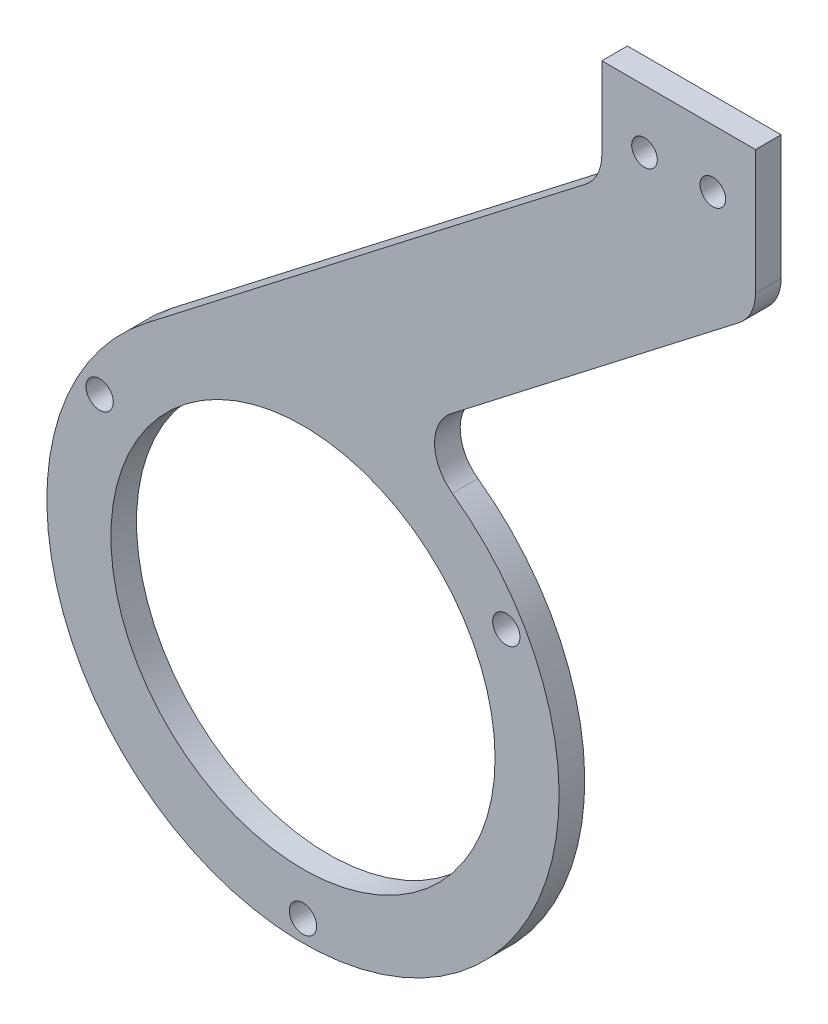
ISO-10303-21;
HEADER;
FILE_DESCRIPTION(('STEP AP214'),'2;1');
FILE_NAME('part.step','',(''),(''),'','','');
FILE_SCHEMA(('AUTOMOTIVE_DESIGN { 1 0 10303 214 1 1 1 1 }'));
ENDSEC;
DATA;
#1=APPLICATION_CONTEXT('core data for automotive mechanical design processes');
#2=APPLICATION_PROTOCOL_DEFINITION('international standard','automotive_design',2000,#1);
#3=PRODUCT_CONTEXT('',#1,'mechanical');
#4=PRODUCT('Part','Part','',(#3));
#5=PRODUCT_RELATED_PRODUCT_CATEGORY('part','',(#4));
#6=PRODUCT_DEFINITION_FORMATION('','',#4);
#7=PRODUCT_DEFINITION_CONTEXT('part definition',#1,'design');
#8=PRODUCT_DEFINITION('design','',#6,#7);
#9=PRODUCT_DEFINITION_SHAPE('','',#8);
#10=(LENGTH_UNIT() NAMED_UNIT(*) SI_UNIT(.MILLI.,.METRE.));
#11=(NAMED_UNIT(*) PLANE_ANGLE_UNIT() SI_UNIT($,.RADIAN.));
#12=(NAMED_UNIT(*) SI_UNIT($,.STERADIAN.) SOLID_ANGLE_UNIT());
#13=UNCERTAINTY_MEASURE_WITH_UNIT(LENGTH_MEASURE(1.E-05),#10,'distance_accuracy_value','');
#14=(GEOMETRIC_REPRESENTATION_CONTEXT(3) GLOBAL_UNCERTAINTY_ASSIGNED_CONTEXT((#13)) GLOBAL_UNIT_ASSIGNED_CONTEXT((#10,
#11,#12)) REPRESENTATION_CONTEXT('',''));
#15=CARTESIAN_POINT('',(0.,0.,0.));
#16=DIRECTION('',(0.,0.,1.));
#17=DIRECTION('',(1.,0.,0.));
#18=AXIS2_PLACEMENT_3D('',#15,#16,#17);
#19=CARTESIAN_POINT('',(0.,0.,3.));
#20=DIRECTION('',(0.,0.,1.));
#21=DIRECTION('',(1.,0.,0.));
#22=AXIS2_PLACEMENT_3D('',#19,#20,#21);
#23=PLANE('',#22);
#24=DIRECTION('',(0.790986985975341,0.611832973954204,0.));
#25=VECTOR('',#24,1.);
#26=CARTESIAN_POINT('',(53.,59.9594537716596,3.));
#27=LINE('',#26,#25);
#28=CARTESIAN_POINT('',(17.353015440065,32.386306599192,3.));
#29=VERTEX_POINT('',#28);
#30=CARTESIAN_POINT('',(51.059164869771,58.4582066579431,3.));
#31=VERTEX_POINT('',#30);
#32=EDGE_CURVE('E137',#29,#31,#27,.T.);
#33=ORIENTED_EDGE('',*,*,#32,.T.);
#34=CARTESIAN_POINT('',(48.,62.4131415878198,3.));
#35=DIRECTION('',(0.,0.,1.));
#36=DIRECTION('',(1.,0.,0.));
#37=AXIS2_PLACEMENT_3D('',#34,#35,#36);
#38=CIRCLE('',#37,5.);
#39=CARTESIAN_POINT('',(53.,62.4131415878198,3.));
#40=VERTEX_POINT('',#39);
#41=EDGE_CURVE('E150',#31,#40,#38,.T.);
#42=ORIENTED_EDGE('',*,*,#41,.T.);
#43=DIRECTION('',(0.,1.,0.));
#44=VECTOR('',#43,1.);
#45=CARTESIAN_POINT('',(53.,77.,3.));
#46=LINE('',#45,#44);
#47=CARTESIAN_POINT('',(53.,77.,3.));
#48=VERTEX_POINT('',#47);
#49=EDGE_CURVE('E141',#40,#48,#46,.T.);
#50=ORIENTED_EDGE('',*,*,#49,.T.);
#51=DIRECTION('',(-1.,0.,0.));
#52=VECTOR('',#51,1.);
#53=CARTESIAN_POINT('',(35.,77.,3.));
#54=LINE('',#53,#52);
#55=CARTESIAN_POINT('',(35.,77.,3.));
#56=VERTEX_POINT('',#55);
#57=EDGE_CURVE('E125',#48,#56,#54,.T.);
#58=ORIENTED_EDGE('',*,*,#57,.T.);
#59=DIRECTION('',(0.,-1.,0.));
#60=VECTOR('',#59,1.);
#61=CARTESIAN_POINT('',(35.,65.,3.));
#62=LINE('',#61,#60);
#63=CARTESIAN_POINT('',(35.,67.4536878161602,3.));
#64=VERTEX_POINT('',#63);
#65=EDGE_CURVE('E169',#56,#64,#62,.T.);
#66=ORIENTED_EDGE('',*,*,#65,.T.);
#67=CARTESIAN_POINT('',(30.,67.4536878161602,3.));
#68=DIRECTION('',(0.,0.,1.));
#69=DIRECTION('',(1.,0.,0.));
#70=AXIS2_PLACEMENT_3D('',#67,#68,#69);
#71=CIRCLE('',#70,5.);
#72=CARTESIAN_POINT('',(33.059164869771,63.4987528862835,3.));
#73=VERTEX_POINT('',#72);
#74=EDGE_CURVE('E45',#64,#73,#71,.F.);
#75=ORIENTED_EDGE('',*,*,#74,.T.);
#76=DIRECTION('',(-0.790986985975341,-0.611832973954204,0.));
#77=VECTOR('',#76,1.);
#78=CARTESIAN_POINT('',(-18.3549892186261,23.7296095792602,3.));
#79=LINE('',#78,#77);
#80=CARTESIAN_POINT('',(-18.3549892186261,23.7296095792602,3.));
#81=VERTEX_POINT('',#80);
#82=EDGE_CURVE('E166',#73,#81,#79,.T.);
#83=ORIENTED_EDGE('',*,*,#82,.T.);
#84=CARTESIAN_POINT('',(0.,0.,3.));
#85=DIRECTION('',(0.,0.,1.));
#86=DIRECTION('',(1.,0.,0.));
#87=AXIS2_PLACEMENT_3D('',#84,#85,#86);
#88=CIRCLE('',#87,30.);
#89=CARTESIAN_POINT('',(17.496154551288,24.3697471451274,3.));
#90=VERTEX_POINT('',#89);
#91=EDGE_CURVE('E211',#81,#90,#88,.T.);
#92=ORIENTED_EDGE('',*,*,#91,.T.);
#93=CARTESIAN_POINT('',(20.412180309836,28.4313716693153,3.));
#94=DIRECTION('',(0.,0.,1.));
#95=DIRECTION('',(1.,0.,0.));
#96=AXIS2_PLACEMENT_3D('',#93,#94,#95);
#97=CIRCLE('',#96,5.);
#98=EDGE_CURVE('E243',#90,#29,#97,.F.);
#99=ORIENTED_EDGE('',*,*,#98,.T.);
#100=EDGE_LOOP('',(#33,#42,#50,#58,#66,#75,#83,#92,#99));
#101=FACE_BOUND('',#100,.T.);
#102=CARTESIAN_POINT('',(48.,70.2,3.));
#103=DIRECTION('',(0.,0.,1.));
#104=DIRECTION('',(1.,0.,0.));
#105=AXIS2_PLACEMENT_3D('',#102,#103,#104);
#106=CIRCLE('',#105,1.5);
#107=CARTESIAN_POINT('',(49.5,70.2,3.));
#108=VERTEX_POINT('',#107);
#109=EDGE_CURVE('E220',#108,#108,#106,.T.);
#110=ORIENTED_EDGE('',*,*,#109,.F.);
#111=EDGE_LOOP('',(#110));
#112=FACE_BOUND('',#111,.T.);
#113=CARTESIAN_POINT('',(40.,70.2,3.));
#114=DIRECTION('',(0.,0.,1.));
#115=DIRECTION('',(1.,0.,0.));
#116=AXIS2_PLACEMENT_3D('',#113,#114,#115);
#117=CIRCLE('',#116,1.5);
#118=CARTESIAN_POINT('',(41.5,70.2,3.));
#119=VERTEX_POINT('',#118);
#120=EDGE_CURVE('E227',#119,#119,#117,.T.);
#121=ORIENTED_EDGE('',*,*,#120,.F.);
#122=EDGE_LOOP('',(#121));
#123=FACE_BOUND('',#122,.T.);
#124=CARTESIAN_POINT('',(-23.8156986040721,13.75,3.));
#125=DIRECTION('',(0.,0.,1.));
#126=DIRECTION('',(1.,0.,0.));
#127=AXIS2_PLACEMENT_3D('',#124,#125,#126);
#128=CIRCLE('',#127,1.6);
#129=CARTESIAN_POINT('',(-22.2156986040721,13.75,3.));
#130=VERTEX_POINT('',#129);
#131=EDGE_CURVE('E183',#130,#130,#128,.T.);
#132=ORIENTED_EDGE('',*,*,#131,.F.);
#133=EDGE_LOOP('',(#132));
#134=FACE_BOUND('',#133,.T.);
#135=CARTESIAN_POINT('',(23.8156986040721,13.75,3.));
#136=DIRECTION('',(0.,0.,1.));
#137=DIRECTION('',(1.,0.,0.));
#138=AXIS2_PLACEMENT_3D('',#135,#136,#137);
#139=CIRCLE('',#138,1.6);
#140=CARTESIAN_POINT('',(25.4156986040721,13.75,3.));
#141=VERTEX_POINT('',#140);
#142=EDGE_CURVE('E195',#141,#141,#139,.T.);
#143=ORIENTED_EDGE('',*,*,#142,.F.);
#144=EDGE_LOOP('',(#143));
#145=FACE_BOUND('',#144,.T.);
#146=CARTESIAN_POINT('',(0.,0.,3.));
#147=DIRECTION('',(0.,0.,1.));
#148=DIRECTION('',(1.,0.,0.));
#149=AXIS2_PLACEMENT_3D('',#146,#147,#148);
#150=CIRCLE('',#149,22.5);
#151=CARTESIAN_POINT('',(22.5,0.,3.));
#152=VERTEX_POINT('',#151);
#153=EDGE_CURVE('E204',#152,#152,#150,.T.);
#154=ORIENTED_EDGE('',*,*,#153,.F.);
#155=EDGE_LOOP('',(#154));
#156=FACE_BOUND('',#155,.T.);
#157=CARTESIAN_POINT('',(0.,-27.5,3.));
#158=DIRECTION('',(0.,0.,1.));
#159=DIRECTION('',(1.,0.,0.));
#160=AXIS2_PLACEMENT_3D('',#157,#158,#159);
#161=CIRCLE('',#160,1.60000000000009);
#162=CARTESIAN_POINT('',(1.60000000000009,-27.5,3.));
#163=VERTEX_POINT('',#162);
#164=EDGE_CURVE('E203',#163,#163,#161,.T.);
#165=ORIENTED_EDGE('',*,*,#164,.F.);
#166=EDGE_LOOP('',(#165));
#167=FACE_BOUND('',#166,.T.);
#168=ADVANCED_FACE('F37',(#101,#112,#123,#134,#145,#156,#167),#23,.T.);
#169=CARTESIAN_POINT('',(0.,0.,0.));
#170=DIRECTION('',(0.,0.,1.));
#171=DIRECTION('',(1.,0.,0.));
#172=AXIS2_PLACEMENT_3D('',#169,#170,#171);
#173=PLANE('',#172);
#174=DIRECTION('',(0.,1.,0.));
#175=VECTOR('',#174,1.);
#176=CARTESIAN_POINT('',(53.,77.,0.));
#177=LINE('',#176,#175);
#178=CARTESIAN_POINT('',(53.,62.4131415878198,0.));
#179=VERTEX_POINT('',#178);
#180=CARTESIAN_POINT('',(53.,77.,0.));
#181=VERTEX_POINT('',#180);
#182=EDGE_CURVE('E108',#179,#181,#177,.T.);
#183=ORIENTED_EDGE('',*,*,#182,.F.);
#184=CARTESIAN_POINT('',(48.,62.4131415878198,0.));
#185=DIRECTION('',(0.,0.,1.));
#186=DIRECTION('',(1.,0.,0.));
#187=AXIS2_PLACEMENT_3D('',#184,#185,#186);
#188=CIRCLE('',#187,5.);
#189=CARTESIAN_POINT('',(51.059164869771,58.4582066579431,0.));
#190=VERTEX_POINT('',#189);
#191=EDGE_CURVE('E157',#179,#190,#188,.F.);
#192=ORIENTED_EDGE('',*,*,#191,.T.);
#193=DIRECTION('',(0.790986985975341,0.611832973954204,0.));
#194=VECTOR('',#193,1.);
#195=CARTESIAN_POINT('',(53.,59.9594537716596,0.));
#196=LINE('',#195,#194);
#197=CARTESIAN_POINT('',(17.353015440065,32.386306599192,0.));
#198=VERTEX_POINT('',#197);
#199=EDGE_CURVE('E119',#198,#190,#196,.T.);
#200=ORIENTED_EDGE('',*,*,#199,.F.);
#201=CARTESIAN_POINT('',(20.412180309836,28.4313716693153,0.));
#202=DIRECTION('',(0.,0.,1.));
#203=DIRECTION('',(1.,0.,0.));
#204=AXIS2_PLACEMENT_3D('',#201,#202,#203);
#205=CIRCLE('',#204,5.);
#206=CARTESIAN_POINT('',(17.496154551288,24.3697471451274,0.));
#207=VERTEX_POINT('',#206);
#208=EDGE_CURVE('E242',#198,#207,#205,.T.);
#209=ORIENTED_EDGE('',*,*,#208,.T.);
#210=CARTESIAN_POINT('',(0.,0.,0.));
#211=DIRECTION('',(0.,0.,1.));
#212=DIRECTION('',(1.,0.,0.));
#213=AXIS2_PLACEMENT_3D('',#210,#211,#212);
#214=CIRCLE('',#213,30.);
#215=CARTESIAN_POINT('',(-18.3549892186261,23.7296095792602,0.));
#216=VERTEX_POINT('',#215);
#217=EDGE_CURVE('E208',#216,#207,#214,.T.);
#218=ORIENTED_EDGE('',*,*,#217,.F.);
#219=DIRECTION('',(-0.790986985975341,-0.611832973954204,0.));
#220=VECTOR('',#219,1.);
#221=CARTESIAN_POINT('',(-18.3549892186261,23.7296095792602,0.));
#222=LINE('',#221,#220);
#223=CARTESIAN_POINT('',(33.059164869771,63.4987528862835,0.));
#224=VERTEX_POINT('',#223);
#225=EDGE_CURVE('E127',#224,#216,#222,.T.);
#226=ORIENTED_EDGE('',*,*,#225,.F.);
#227=CARTESIAN_POINT('',(30.,67.4536878161602,0.));
#228=DIRECTION('',(0.,0.,1.));
#229=DIRECTION('',(1.,0.,0.));
#230=AXIS2_PLACEMENT_3D('',#227,#228,#229);
#231=CIRCLE('',#230,5.);
#232=CARTESIAN_POINT('',(35.,67.4536878161602,0.));
#233=VERTEX_POINT('',#232);
#234=EDGE_CURVE('E12',#224,#233,#231,.T.);
#235=ORIENTED_EDGE('',*,*,#234,.T.);
#236=DIRECTION('',(0.,-1.,0.));
#237=VECTOR('',#236,1.);
#238=CARTESIAN_POINT('',(35.,65.,0.));
#239=LINE('',#238,#237);
#240=CARTESIAN_POINT('',(35.,77.,0.));
#241=VERTEX_POINT('',#240);
#242=EDGE_CURVE('E131',#241,#233,#239,.T.);
#243=ORIENTED_EDGE('',*,*,#242,.F.);
#244=DIRECTION('',(-1.,0.,0.));
#245=VECTOR('',#244,1.);
#246=CARTESIAN_POINT('',(35.,77.,0.));
#247=LINE('',#246,#245);
#248=EDGE_CURVE('E118',#181,#241,#247,.T.);
#249=ORIENTED_EDGE('',*,*,#248,.F.);
#250=EDGE_LOOP('',(#183,#192,#200,#209,#218,#226,#235,#243,#249));
#251=FACE_BOUND('',#250,.T.);
#252=CARTESIAN_POINT('',(48.,70.2,0.));
#253=DIRECTION('',(0.,0.,1.));
#254=DIRECTION('',(1.,0.,0.));
#255=AXIS2_PLACEMENT_3D('',#252,#253,#254);
#256=CIRCLE('',#255,1.5);
#257=CARTESIAN_POINT('',(49.5,70.2,0.));
#258=VERTEX_POINT('',#257);
#259=EDGE_CURVE('E225',#258,#258,#256,.T.);
#260=ORIENTED_EDGE('',*,*,#259,.T.);
#261=EDGE_LOOP('',(#260));
#262=FACE_BOUND('',#261,.T.);
#263=CARTESIAN_POINT('',(40.,70.2,0.));
#264=DIRECTION('',(0.,0.,1.));
#265=DIRECTION('',(1.,0.,0.));
#266=AXIS2_PLACEMENT_3D('',#263,#264,#265);
#267=CIRCLE('',#266,1.5);
#268=CARTESIAN_POINT('',(41.5,70.2,0.));
#269=VERTEX_POINT('',#268);
#270=EDGE_CURVE('E142',#269,#269,#267,.T.);
#271=ORIENTED_EDGE('',*,*,#270,.T.);
#272=EDGE_LOOP('',(#271));
#273=FACE_BOUND('',#272,.T.);
#274=CARTESIAN_POINT('',(0.,0.,0.));
#275=DIRECTION('',(0.,0.,1.));
#276=DIRECTION('',(1.,0.,0.));
#277=AXIS2_PLACEMENT_3D('',#274,#275,#276);
#278=CIRCLE('',#277,22.5);
#279=CARTESIAN_POINT('',(22.5,0.,0.));
#280=VERTEX_POINT('',#279);
#281=EDGE_CURVE('E200',#280,#280,#278,.T.);
#282=ORIENTED_EDGE('',*,*,#281,.T.);
#283=EDGE_LOOP('',(#282));
#284=FACE_BOUND('',#283,.T.);
#285=CARTESIAN_POINT('',(23.8156986040721,13.75,0.));
#286=DIRECTION('',(0.,0.,1.));
#287=DIRECTION('',(1.,0.,0.));
#288=AXIS2_PLACEMENT_3D('',#285,#286,#287);
#289=CIRCLE('',#288,1.6);
#290=CARTESIAN_POINT('',(25.4156986040721,13.75,0.));
#291=VERTEX_POINT('',#290);
#292=EDGE_CURVE('E201',#291,#291,#289,.T.);
#293=ORIENTED_EDGE('',*,*,#292,.T.);
#294=EDGE_LOOP('',(#293));
#295=FACE_BOUND('',#294,.T.);
#296=CARTESIAN_POINT('',(0.,-27.5,0.));
#297=DIRECTION('',(0.,0.,1.));
#298=DIRECTION('',(1.,0.,0.));
#299=AXIS2_PLACEMENT_3D('',#296,#297,#298);
#300=CIRCLE('',#299,1.60000000000009);
#301=CARTESIAN_POINT('',(1.60000000000009,-27.5,0.));
#302=VERTEX_POINT('',#301);
#303=EDGE_CURVE('E187',#302,#302,#300,.T.);
#304=ORIENTED_EDGE('',*,*,#303,.T.);
#305=EDGE_LOOP('',(#304));
#306=FACE_BOUND('',#305,.T.);
#307=CARTESIAN_POINT('',(-23.8156986040721,13.75,0.));
#308=DIRECTION('',(0.,0.,1.));
#309=DIRECTION('',(1.,0.,0.));
#310=AXIS2_PLACEMENT_3D('',#307,#308,#309);
#311=CIRCLE('',#310,1.6);
#312=CARTESIAN_POINT('',(-22.2156986040721,13.75,0.));
#313=VERTEX_POINT('',#312);
#314=EDGE_CURVE('E180',#313,#313,#311,.T.);
#315=ORIENTED_EDGE('',*,*,#314,.T.);
#316=EDGE_LOOP('',(#315));
#317=FACE_BOUND('',#316,.T.);
#318=ADVANCED_FACE('F129',(#251,#262,#273,#284,#295,#306,#317),#173,.F.);
#319=CARTESIAN_POINT('',(0.,0.,3.));
#320=DIRECTION('',(0.,0.,-1.));
#321=DIRECTION('',(-1.,0.,0.));
#322=AXIS2_PLACEMENT_3D('',#319,#320,#321);
#323=CYLINDRICAL_SURFACE('',#322,30.);
#324=ORIENTED_EDGE('',*,*,#217,.T.);
#325=DIRECTION('',(0.,0.,-1.));
#326=VECTOR('',#325,1.);
#327=CARTESIAN_POINT('',(17.496154551288,24.3697471451274,3.));
#328=LINE('',#327,#326);
#329=EDGE_CURVE('E214',#207,#90,#328,.F.);
#330=ORIENTED_EDGE('',*,*,#329,.T.);
#331=ORIENTED_EDGE('',*,*,#91,.F.);
#332=DIRECTION('',(0.,0.,1.));
#333=VECTOR('',#332,1.);
#334=CARTESIAN_POINT('',(-18.3549892186261,23.7296095792602,0.));
#335=LINE('',#334,#333);
#336=EDGE_CURVE('E174',#216,#81,#335,.T.);
#337=ORIENTED_EDGE('',*,*,#336,.F.);
#338=EDGE_LOOP('',(#324,#330,#331,#337));
#339=FACE_BOUND('',#338,.T.);
#340=ADVANCED_FACE('F251',(#339),#323,.T.);
#341=CARTESIAN_POINT('',(0.,0.,3.));
#342=DIRECTION('',(0.,0.,-1.));
#343=DIRECTION('',(-1.,0.,0.));
#344=AXIS2_PLACEMENT_3D('',#341,#342,#343);
#345=CYLINDRICAL_SURFACE('',#344,22.5);
#346=ORIENTED_EDGE('',*,*,#153,.T.);
#347=EDGE_LOOP('',(#346));
#348=FACE_BOUND('',#347,.T.);
#349=ORIENTED_EDGE('',*,*,#281,.F.);
#350=EDGE_LOOP('',(#349));
#351=FACE_BOUND('',#350,.T.);
#352=ADVANCED_FACE('F272',(#348,#351),#345,.F.);
#353=CARTESIAN_POINT('',(23.8156986040721,13.75,3.));
#354=DIRECTION('',(0.,0.,-1.));
#355=DIRECTION('',(-1.,0.,0.));
#356=AXIS2_PLACEMENT_3D('',#353,#354,#355);
#357=CYLINDRICAL_SURFACE('',#356,1.6);
#358=ORIENTED_EDGE('',*,*,#142,.T.);
#359=EDGE_LOOP('',(#358));
#360=FACE_BOUND('',#359,.T.);
#361=ORIENTED_EDGE('',*,*,#292,.F.);
#362=EDGE_LOOP('',(#361));
#363=FACE_BOUND('',#362,.T.);
#364=ADVANCED_FACE('F278',(#360,#363),#357,.F.);
#365=CARTESIAN_POINT('',(0.,-27.5,3.));
#366=DIRECTION('',(0.,0.,-1.));
#367=DIRECTION('',(-1.,0.,0.));
#368=AXIS2_PLACEMENT_3D('',#365,#366,#367);
#369=CYLINDRICAL_SURFACE('',#368,1.60000000000009);
#370=ORIENTED_EDGE('',*,*,#164,.T.);
#371=EDGE_LOOP('',(#370));
#372=FACE_BOUND('',#371,.T.);
#373=ORIENTED_EDGE('',*,*,#303,.F.);
#374=EDGE_LOOP('',(#373));
#375=FACE_BOUND('',#374,.T.);
#376=ADVANCED_FACE('F283',(#372,#375),#369,.F.);
#377=CARTESIAN_POINT('',(-23.8156986040721,13.75,3.));
#378=DIRECTION('',(0.,0.,-1.));
#379=DIRECTION('',(-1.,0.,0.));
#380=AXIS2_PLACEMENT_3D('',#377,#378,#379);
#381=CYLINDRICAL_SURFACE('',#380,1.6);
#382=ORIENTED_EDGE('',*,*,#131,.T.);
#383=EDGE_LOOP('',(#382));
#384=FACE_BOUND('',#383,.T.);
#385=ORIENTED_EDGE('',*,*,#314,.F.);
#386=EDGE_LOOP('',(#385));
#387=FACE_BOUND('',#386,.T.);
#388=ADVANCED_FACE('F298',(#384,#387),#381,.F.);
#389=CARTESIAN_POINT('',(-18.3549892186261,23.7296095792602,0.));
#390=DIRECTION('',(-0.611832973954204,0.790986985975341,0.));
#391=DIRECTION('',(-0.790986985975341,-0.611832973954204,0.));
#392=AXIS2_PLACEMENT_3D('',#389,#390,#391);
#393=PLANE('',#392);
#394=ORIENTED_EDGE('',*,*,#82,.F.);
#395=DIRECTION('',(0.,0.,1.));
#396=VECTOR('',#395,1.);
#397=CARTESIAN_POINT('',(33.059164869771,63.4987528862835,0.));
#398=LINE('',#397,#396);
#399=EDGE_CURVE('E58',#73,#224,#398,.F.);
#400=ORIENTED_EDGE('',*,*,#399,.T.);
#401=ORIENTED_EDGE('',*,*,#225,.T.);
#402=ORIENTED_EDGE('',*,*,#336,.T.);
#403=EDGE_LOOP('',(#394,#400,#401,#402));
#404=FACE_BOUND('',#403,.T.);
#405=ADVANCED_FACE('F172',(#404),#393,.T.);
#406=CARTESIAN_POINT('',(35.,65.,0.));
#407=DIRECTION('',(-1.,0.,0.));
#408=DIRECTION('',(0.,-1.,0.));
#409=AXIS2_PLACEMENT_3D('',#406,#407,#408);
#410=PLANE('',#409);
#411=ORIENTED_EDGE('',*,*,#242,.T.);
#412=DIRECTION('',(0.,0.,1.));
#413=VECTOR('',#412,1.);
#414=CARTESIAN_POINT('',(35.,67.4536878161602,3.));
#415=LINE('',#414,#413);
#416=EDGE_CURVE('E159',#233,#64,#415,.T.);
#417=ORIENTED_EDGE('',*,*,#416,.T.);
#418=ORIENTED_EDGE('',*,*,#65,.F.);
#419=DIRECTION('',(0.,0.,1.));
#420=VECTOR('',#419,1.);
#421=CARTESIAN_POINT('',(35.,77.,0.));
#422=LINE('',#421,#420);
#423=EDGE_CURVE('E126',#241,#56,#422,.T.);
#424=ORIENTED_EDGE('',*,*,#423,.F.);
#425=EDGE_LOOP('',(#411,#417,#418,#424));
#426=FACE_BOUND('',#425,.T.);
#427=ADVANCED_FACE('F178',(#426),#410,.T.);
#428=CARTESIAN_POINT('',(35.,77.,0.));
#429=DIRECTION('',(0.,1.,0.));
#430=DIRECTION('',(-1.,0.,0.));
#431=AXIS2_PLACEMENT_3D('',#428,#429,#430);
#432=PLANE('',#431);
#433=ORIENTED_EDGE('',*,*,#57,.F.);
#434=DIRECTION('',(0.,0.,1.));
#435=VECTOR('',#434,1.);
#436=CARTESIAN_POINT('',(53.,77.,0.));
#437=LINE('',#436,#435);
#438=EDGE_CURVE('E112',#181,#48,#437,.T.);
#439=ORIENTED_EDGE('',*,*,#438,.F.);
#440=ORIENTED_EDGE('',*,*,#248,.T.);
#441=ORIENTED_EDGE('',*,*,#423,.T.);
#442=EDGE_LOOP('',(#433,#439,#440,#441));
#443=FACE_BOUND('',#442,.T.);
#444=ADVANCED_FACE('F123',(#443),#432,.T.);
#445=CARTESIAN_POINT('',(53.,77.,0.));
#446=DIRECTION('',(1.,0.,0.));
#447=DIRECTION('',(0.,1.,0.));
#448=AXIS2_PLACEMENT_3D('',#445,#446,#447);
#449=PLANE('',#448);
#450=ORIENTED_EDGE('',*,*,#49,.F.);
#451=DIRECTION('',(0.,0.,1.));
#452=VECTOR('',#451,1.);
#453=CARTESIAN_POINT('',(53.,62.4131415878198,0.));
#454=LINE('',#453,#452);
#455=EDGE_CURVE('E115',#40,#179,#454,.F.);
#456=ORIENTED_EDGE('',*,*,#455,.T.);
#457=ORIENTED_EDGE('',*,*,#182,.T.);
#458=ORIENTED_EDGE('',*,*,#438,.T.);
#459=EDGE_LOOP('',(#450,#456,#457,#458));
#460=FACE_BOUND('',#459,.T.);
#461=ADVANCED_FACE('F111',(#460),#449,.T.);
#462=CARTESIAN_POINT('',(53.,59.9594537716596,0.));
#463=DIRECTION('',(0.611832973954204,-0.790986985975341,0.));
#464=DIRECTION('',(0.790986985975341,0.611832973954204,0.));
#465=AXIS2_PLACEMENT_3D('',#462,#463,#464);
#466=PLANE('',#465);
#467=ORIENTED_EDGE('',*,*,#199,.T.);
#468=DIRECTION('',(0.,0.,1.));
#469=VECTOR('',#468,1.);
#470=CARTESIAN_POINT('',(51.059164869771,58.4582066579431,0.));
#471=LINE('',#470,#469);
#472=EDGE_CURVE('E154',#190,#31,#471,.T.);
#473=ORIENTED_EDGE('',*,*,#472,.T.);
#474=ORIENTED_EDGE('',*,*,#32,.F.);
#475=DIRECTION('',(0.,0.,-1.));
#476=VECTOR('',#475,1.);
#477=CARTESIAN_POINT('',(17.353015440065,32.386306599192,0.));
#478=LINE('',#477,#476);
#479=EDGE_CURVE('E238',#29,#198,#478,.T.);
#480=ORIENTED_EDGE('',*,*,#479,.T.);
#481=EDGE_LOOP('',(#467,#473,#474,#480));
#482=FACE_BOUND('',#481,.T.);
#483=ADVANCED_FACE('F235',(#482),#466,.T.);
#484=CARTESIAN_POINT('',(40.,70.2,0.));
#485=DIRECTION('',(0.,0.,1.));
#486=DIRECTION('',(1.,0.,0.));
#487=AXIS2_PLACEMENT_3D('',#484,#485,#486);
#488=CYLINDRICAL_SURFACE('',#487,1.5);
#489=ORIENTED_EDGE('',*,*,#270,.F.);
#490=EDGE_LOOP('',(#489));
#491=FACE_BOUND('',#490,.T.);
#492=ORIENTED_EDGE('',*,*,#120,.T.);
#493=EDGE_LOOP('',(#492));
#494=FACE_BOUND('',#493,.T.);
#495=ADVANCED_FACE('F261',(#491,#494),#488,.F.);
#496=CARTESIAN_POINT('',(48.,70.2,0.));
#497=DIRECTION('',(0.,0.,1.));
#498=DIRECTION('',(1.,0.,0.));
#499=AXIS2_PLACEMENT_3D('',#496,#497,#498);
#500=CYLINDRICAL_SURFACE('',#499,1.5);
#501=ORIENTED_EDGE('',*,*,#259,.F.);
#502=EDGE_LOOP('',(#501));
#503=FACE_BOUND('',#502,.T.);
#504=ORIENTED_EDGE('',*,*,#109,.T.);
#505=EDGE_LOOP('',(#504));
#506=FACE_BOUND('',#505,.T.);
#507=ADVANCED_FACE('F255',(#503,#506),#500,.F.);
#508=CARTESIAN_POINT('',(20.412180309836,28.4313716693153,3.));
#509=DIRECTION('',(0.,0.,-1.));
#510=DIRECTION('',(-1.,0.,0.));
#511=AXIS2_PLACEMENT_3D('',#508,#509,#510);
#512=CYLINDRICAL_SURFACE('',#511,5.);
#513=ORIENTED_EDGE('',*,*,#208,.F.);
#514=ORIENTED_EDGE('',*,*,#479,.F.);
#515=ORIENTED_EDGE('',*,*,#98,.F.);
#516=ORIENTED_EDGE('',*,*,#329,.F.);
#517=EDGE_LOOP('',(#513,#514,#515,#516));
#518=FACE_BOUND('',#517,.T.);
#519=ADVANCED_FACE('F253',(#518),#512,.F.);
#520=CARTESIAN_POINT('',(48.,62.4131415878198,0.));
#521=DIRECTION('',(0.,0.,1.));
#522=DIRECTION('',(1.,0.,0.));
#523=AXIS2_PLACEMENT_3D('',#520,#521,#522);
#524=CYLINDRICAL_SURFACE('',#523,5.);
#525=ORIENTED_EDGE('',*,*,#191,.F.);
#526=ORIENTED_EDGE('',*,*,#455,.F.);
#527=ORIENTED_EDGE('',*,*,#41,.F.);
#528=ORIENTED_EDGE('',*,*,#472,.F.);
#529=EDGE_LOOP('',(#525,#526,#527,#528));
#530=FACE_BOUND('',#529,.T.);
#531=ADVANCED_FACE('F241',(#530),#524,.T.);
#532=CARTESIAN_POINT('',(30.,67.4536878161602,0.));
#533=DIRECTION('',(0.,0.,-1.));
#534=DIRECTION('',(-1.,0.,0.));
#535=AXIS2_PLACEMENT_3D('',#532,#533,#534);
#536=CYLINDRICAL_SURFACE('',#535,5.);
#537=ORIENTED_EDGE('',*,*,#234,.F.);
#538=ORIENTED_EDGE('',*,*,#399,.F.);
#539=ORIENTED_EDGE('',*,*,#74,.F.);
#540=ORIENTED_EDGE('',*,*,#416,.F.);
#541=EDGE_LOOP('',(#537,#538,#539,#540));
#542=FACE_BOUND('',#541,.T.);
#543=ADVANCED_FACE('F39',(#542),#536,.F.);
#544=CLOSED_SHELL('',(#168,#318,#340,#352,#364,#376,#388,#405,#427,#444,#461,#483,#495,#507,
#519,#531,#543));
#545=MANIFOLD_SOLID_BREP('B2',#544);
#546=ADVANCED_BREP_SHAPE_REPRESENTATION('',(#18,#545),#14);
#547=SHAPE_DEFINITION_REPRESENTATION(#9,#546);
ENDSEC;
END-ISO-10303-21;
